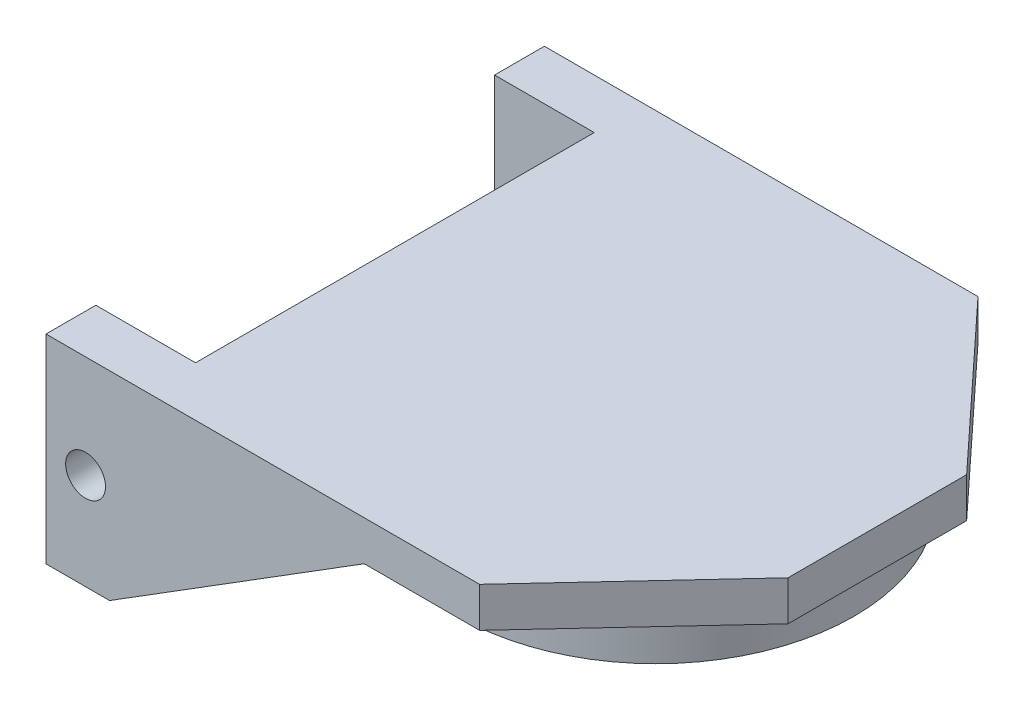
ISO-10303-21;
HEADER;
FILE_DESCRIPTION(('STEP AP214'),'2;1');
FILE_NAME('part.step','',(''),(''),'','','');
FILE_SCHEMA(('AUTOMOTIVE_DESIGN { 1 0 10303 214 1 1 1 1 }'));
ENDSEC;
DATA;
#1=APPLICATION_CONTEXT('core data for automotive mechanical design processes');
#2=APPLICATION_PROTOCOL_DEFINITION('international standard','automotive_design',2000,#1);
#3=PRODUCT_CONTEXT('',#1,'mechanical');
#4=PRODUCT('Part','Part','',(#3));
#5=PRODUCT_RELATED_PRODUCT_CATEGORY('part','',(#4));
#6=PRODUCT_DEFINITION_FORMATION('','',#4);
#7=PRODUCT_DEFINITION_CONTEXT('part definition',#1,'design');
#8=PRODUCT_DEFINITION('design','',#6,#7);
#9=PRODUCT_DEFINITION_SHAPE('','',#8);
#10=(LENGTH_UNIT() NAMED_UNIT(*) SI_UNIT(.MILLI.,.METRE.));
#11=(NAMED_UNIT(*) PLANE_ANGLE_UNIT() SI_UNIT($,.RADIAN.));
#12=(NAMED_UNIT(*) SI_UNIT($,.STERADIAN.) SOLID_ANGLE_UNIT());
#13=UNCERTAINTY_MEASURE_WITH_UNIT(LENGTH_MEASURE(1.E-05),#10,'distance_accuracy_value','');
#14=(GEOMETRIC_REPRESENTATION_CONTEXT(3) GLOBAL_UNCERTAINTY_ASSIGNED_CONTEXT((#13)) GLOBAL_UNIT_ASSIGNED_CONTEXT((#10,
#11,#12)) REPRESENTATION_CONTEXT('',''));
#15=CARTESIAN_POINT('',(0.,0.,0.));
#16=DIRECTION('',(0.,0.,1.));
#17=DIRECTION('',(1.,0.,0.));
#18=AXIS2_PLACEMENT_3D('',#15,#16,#17);
#19=CARTESIAN_POINT('',(0.,0.,0.));
#20=DIRECTION('',(0.,1.,0.));
#21=DIRECTION('',(0.,0.,1.));
#22=AXIS2_PLACEMENT_3D('',#19,#20,#21);
#23=PLANE('',#22);
#24=CARTESIAN_POINT('',(18.0898457890056,0.,-12.5));
#25=DIRECTION('',(0.,1.,0.));
#26=DIRECTION('',(0.,0.,1.));
#27=AXIS2_PLACEMENT_3D('',#24,#25,#26);
#28=CIRCLE('',#27,9.9415763307506);
#29=CARTESIAN_POINT('',(18.0898457890056,0.,-2.55842366924939));
#30=VERTEX_POINT('',#29);
#31=EDGE_CURVE('E11',#30,#30,#28,.F.);
#32=ORIENTED_EDGE('',*,*,#31,.F.);
#33=EDGE_LOOP('',(#32));
#34=FACE_BOUND('',#33,.T.);
#35=DIRECTION('',(0.,0.,1.));
#36=VECTOR('',#35,1.);
#37=CARTESIAN_POINT('',(29.1989422190613,0.,0.));
#38=LINE('',#37,#36);
#39=CARTESIAN_POINT('',(29.1989422190613,0.,-16.9802673249968));
#40=VERTEX_POINT('',#39);
#41=CARTESIAN_POINT('',(29.1989422190613,0.,-8.01973267500323));
#42=VERTEX_POINT('',#41);
#43=EDGE_CURVE('E149',#40,#42,#38,.T.);
#44=ORIENTED_EDGE('',*,*,#43,.T.);
#45=DIRECTION('',(-0.68060560831104,0.,0.73264998869553));
#46=VECTOR('',#45,1.);
#47=CARTESIAN_POINT('',(11.6742864386424,0.,10.8449941251163));
#48=LINE('',#47,#46);
#49=CARTESIAN_POINT('',(21.748897695781,0.,0.));
#50=VERTEX_POINT('',#49);
#51=EDGE_CURVE('E175',#42,#50,#48,.T.);
#52=ORIENTED_EDGE('',*,*,#51,.T.);
#53=DIRECTION('',(1.,0.,0.));
#54=VECTOR('',#53,1.);
#55=CARTESIAN_POINT('',(0.,0.,0.));
#56=LINE('',#55,#54);
#57=CARTESIAN_POINT('',(15.9629524646424,0.,0.));
#58=VERTEX_POINT('',#57);
#59=EDGE_CURVE('E253',#58,#50,#56,.T.);
#60=ORIENTED_EDGE('',*,*,#59,.F.);
#61=DIRECTION('',(0.,0.,1.));
#62=VECTOR('',#61,1.);
#63=CARTESIAN_POINT('',(15.9629524646424,0.,-2.5));
#64=LINE('',#63,#62);
#65=CARTESIAN_POINT('',(15.9629524646424,0.,-2.5));
#66=VERTEX_POINT('',#65);
#67=EDGE_CURVE('E230',#66,#58,#64,.T.);
#68=ORIENTED_EDGE('',*,*,#67,.F.);
#69=DIRECTION('',(1.,0.,0.));
#70=VECTOR('',#69,1.);
#71=CARTESIAN_POINT('',(0.,0.,-2.5));
#72=LINE('',#71,#70);
#73=CARTESIAN_POINT('',(5.,0.,-2.5));
#74=VERTEX_POINT('',#73);
#75=EDGE_CURVE('E48',#74,#66,#72,.T.);
#76=ORIENTED_EDGE('',*,*,#75,.F.);
#77=DIRECTION('',(0.,0.,1.));
#78=VECTOR('',#77,1.);
#79=CARTESIAN_POINT('',(5.,0.,0.));
#80=LINE('',#79,#78);
#81=CARTESIAN_POINT('',(5.,0.,-22.5));
#82=VERTEX_POINT('',#81);
#83=EDGE_CURVE('E229',#82,#74,#80,.T.);
#84=ORIENTED_EDGE('',*,*,#83,.F.);
#85=DIRECTION('',(1.,0.,0.));
#86=VECTOR('',#85,1.);
#87=CARTESIAN_POINT('',(15.9629524646424,0.,-22.5));
#88=LINE('',#87,#86);
#89=CARTESIAN_POINT('',(15.9629524646424,0.,-22.5));
#90=VERTEX_POINT('',#89);
#91=EDGE_CURVE('E63',#82,#90,#88,.T.);
#92=ORIENTED_EDGE('',*,*,#91,.T.);
#93=DIRECTION('',(0.,0.,-1.));
#94=VECTOR('',#93,1.);
#95=CARTESIAN_POINT('',(15.9629524646424,0.,-22.5));
#96=LINE('',#95,#94);
#97=CARTESIAN_POINT('',(15.9629524646424,0.,-25.));
#98=VERTEX_POINT('',#97);
#99=EDGE_CURVE('E193',#90,#98,#96,.T.);
#100=ORIENTED_EDGE('',*,*,#99,.T.);
#101=DIRECTION('',(1.,0.,0.));
#102=VECTOR('',#101,1.);
#103=CARTESIAN_POINT('',(0.,0.,-25.));
#104=LINE('',#103,#102);
#105=CARTESIAN_POINT('',(21.748897695781,0.,-25.));
#106=VERTEX_POINT('',#105);
#107=EDGE_CURVE('E238',#98,#106,#104,.T.);
#108=ORIENTED_EDGE('',*,*,#107,.T.);
#109=DIRECTION('',(0.680605608311039,0.,0.73264998869553));
#110=VECTOR('',#109,1.);
#111=CARTESIAN_POINT('',(24.1404287195224,0.,-22.4255939767273));
#112=LINE('',#111,#110);
#113=EDGE_CURVE('E170',#106,#40,#112,.T.);
#114=ORIENTED_EDGE('',*,*,#113,.T.);
#115=EDGE_LOOP('',(#44,#52,#60,#68,#76,#84,#92,#100,#108,#114));
#116=FACE_BOUND('',#115,.T.);
#117=ADVANCED_FACE('F40',(#34,#116),#23,.F.);
#118=CARTESIAN_POINT('',(0.,2.,-22.5));
#119=DIRECTION('',(0.,0.,-1.));
#120=DIRECTION('',(-1.,0.,0.));
#121=AXIS2_PLACEMENT_3D('',#118,#119,#120);
#122=PLANE('',#121);
#123=DIRECTION('',(0.,-1.,0.));
#124=VECTOR('',#123,1.);
#125=CARTESIAN_POINT('',(0.,2.,-22.5));
#126=LINE('',#125,#124);
#127=CARTESIAN_POINT('',(0.,2.,-22.5));
#128=VERTEX_POINT('',#127);
#129=CARTESIAN_POINT('',(0.,-7.98613617756479,-22.5));
#130=VERTEX_POINT('',#129);
#131=EDGE_CURVE('E258',#128,#130,#126,.T.);
#132=ORIENTED_EDGE('',*,*,#131,.T.);
#133=DIRECTION('',(-1.,0.,0.));
#134=VECTOR('',#133,1.);
#135=CARTESIAN_POINT('',(0.,-7.98613617756479,-22.5));
#136=LINE('',#135,#134);
#137=CARTESIAN_POINT('',(3.18779020650883,-7.98613617756479,-22.5));
#138=VERTEX_POINT('',#137);
#139=EDGE_CURVE('E190',#138,#130,#136,.T.);
#140=ORIENTED_EDGE('',*,*,#139,.F.);
#141=DIRECTION('',(-0.847948787205841,-0.530078158648462,0.));
#142=VECTOR('',#141,1.);
#143=CARTESIAN_POINT('',(3.18779020650883,-7.98613617756479,-22.5));
#144=LINE('',#143,#142);
#145=EDGE_CURVE('E186',#90,#138,#144,.T.);
#146=ORIENTED_EDGE('',*,*,#145,.F.);
#147=ORIENTED_EDGE('',*,*,#91,.F.);
#148=DIRECTION('',(0.,-1.,0.));
#149=VECTOR('',#148,1.);
#150=CARTESIAN_POINT('',(5.,2.,-22.5));
#151=LINE('',#150,#149);
#152=CARTESIAN_POINT('',(5.,2.,-22.5));
#153=VERTEX_POINT('',#152);
#154=EDGE_CURVE('E221',#153,#82,#151,.T.);
#155=ORIENTED_EDGE('',*,*,#154,.F.);
#156=DIRECTION('',(1.,0.,0.));
#157=VECTOR('',#156,1.);
#158=CARTESIAN_POINT('',(0.,2.,-22.5));
#159=LINE('',#158,#157);
#160=EDGE_CURVE('E234',#128,#153,#159,.T.);
#161=ORIENTED_EDGE('',*,*,#160,.F.);
#162=EDGE_LOOP('',(#132,#140,#146,#147,#155,#161));
#163=FACE_BOUND('',#162,.T.);
#164=CARTESIAN_POINT('',(1.98451841065257,-3.14667725421077,-22.5));
#165=DIRECTION('',(0.,0.,-1.));
#166=DIRECTION('',(-1.,0.,0.));
#167=AXIS2_PLACEMENT_3D('',#164,#165,#166);
#168=CIRCLE('',#167,1.);
#169=CARTESIAN_POINT('',(0.984518410652568,-3.14667725421077,-22.5));
#170=VERTEX_POINT('',#169);
#171=EDGE_CURVE('E179',#170,#170,#168,.T.);
#172=ORIENTED_EDGE('',*,*,#171,.T.);
#173=EDGE_LOOP('',(#172));
#174=FACE_BOUND('',#173,.T.);
#175=ADVANCED_FACE('F42',(#163,#174),#122,.F.);
#176=CARTESIAN_POINT('',(5.,2.,0.));
#177=DIRECTION('',(1.,0.,0.));
#178=DIRECTION('',(0.,0.,-1.));
#179=AXIS2_PLACEMENT_3D('',#176,#177,#178);
#180=PLANE('',#179);
#181=ORIENTED_EDGE('',*,*,#83,.T.);
#182=DIRECTION('',(0.,-1.,0.));
#183=VECTOR('',#182,1.);
#184=CARTESIAN_POINT('',(5.,2.,-2.5));
#185=LINE('',#184,#183);
#186=CARTESIAN_POINT('',(5.,2.,-2.5));
#187=VERTEX_POINT('',#186);
#188=EDGE_CURVE('E266',#187,#74,#185,.T.);
#189=ORIENTED_EDGE('',*,*,#188,.F.);
#190=DIRECTION('',(0.,0.,1.));
#191=VECTOR('',#190,1.);
#192=CARTESIAN_POINT('',(5.,2.,0.));
#193=LINE('',#192,#191);
#194=EDGE_CURVE('E237',#153,#187,#193,.T.);
#195=ORIENTED_EDGE('',*,*,#194,.F.);
#196=ORIENTED_EDGE('',*,*,#154,.T.);
#197=EDGE_LOOP('',(#181,#189,#195,#196));
#198=FACE_BOUND('',#197,.T.);
#199=ADVANCED_FACE('F271',(#198),#180,.F.);
#200=CARTESIAN_POINT('',(0.,2.,-2.5));
#201=DIRECTION('',(0.,0.,-1.));
#202=DIRECTION('',(-1.,0.,0.));
#203=AXIS2_PLACEMENT_3D('',#200,#201,#202);
#204=PLANE('',#203);
#205=CARTESIAN_POINT('',(1.98451841065257,-3.14667725421077,-2.5));
#206=DIRECTION('',(0.,0.,1.));
#207=DIRECTION('',(1.,0.,0.));
#208=AXIS2_PLACEMENT_3D('',#205,#206,#207);
#209=CIRCLE('',#208,1.);
#210=CARTESIAN_POINT('',(2.98451841065257,-3.14667725421077,-2.5));
#211=VERTEX_POINT('',#210);
#212=EDGE_CURVE('E205',#211,#211,#209,.T.);
#213=ORIENTED_EDGE('',*,*,#212,.T.);
#214=EDGE_LOOP('',(#213));
#215=FACE_BOUND('',#214,.T.);
#216=ORIENTED_EDGE('',*,*,#188,.T.);
#217=ORIENTED_EDGE('',*,*,#75,.T.);
#218=DIRECTION('',(0.847948787205841,0.530078158648462,0.));
#219=VECTOR('',#218,1.);
#220=CARTESIAN_POINT('',(4.48531594618962,-7.17501401397826,-2.5));
#221=LINE('',#220,#219);
#222=CARTESIAN_POINT('',(3.18779020650883,-7.98613617756479,-2.5));
#223=VERTEX_POINT('',#222);
#224=EDGE_CURVE('E214',#223,#66,#221,.T.);
#225=ORIENTED_EDGE('',*,*,#224,.F.);
#226=DIRECTION('',(1.,0.,0.));
#227=VECTOR('',#226,1.);
#228=CARTESIAN_POINT('',(0.,-7.98613617756479,-2.5));
#229=LINE('',#228,#227);
#230=CARTESIAN_POINT('',(0.,-7.98613617756479,-2.5));
#231=VERTEX_POINT('',#230);
#232=EDGE_CURVE('E211',#231,#223,#229,.T.);
#233=ORIENTED_EDGE('',*,*,#232,.F.);
#234=DIRECTION('',(0.,-1.,0.));
#235=VECTOR('',#234,1.);
#236=CARTESIAN_POINT('',(0.,2.,-2.5));
#237=LINE('',#236,#235);
#238=CARTESIAN_POINT('',(0.,2.,-2.5));
#239=VERTEX_POINT('',#238);
#240=EDGE_CURVE('E264',#239,#231,#237,.T.);
#241=ORIENTED_EDGE('',*,*,#240,.F.);
#242=DIRECTION('',(1.,0.,0.));
#243=VECTOR('',#242,1.);
#244=CARTESIAN_POINT('',(0.,2.,-2.5));
#245=LINE('',#244,#243);
#246=EDGE_CURVE('E240',#239,#187,#245,.T.);
#247=ORIENTED_EDGE('',*,*,#246,.T.);
#248=EDGE_LOOP('',(#216,#217,#225,#233,#241,#247));
#249=FACE_BOUND('',#248,.T.);
#250=ADVANCED_FACE('F294',(#215,#249),#204,.T.);
#251=CARTESIAN_POINT('',(0.,2.,0.));
#252=DIRECTION('',(-1.,0.,0.));
#253=DIRECTION('',(0.,0.,1.));
#254=AXIS2_PLACEMENT_3D('',#251,#252,#253);
#255=PLANE('',#254);
#256=ORIENTED_EDGE('',*,*,#240,.T.);
#257=DIRECTION('',(0.,0.,1.));
#258=VECTOR('',#257,1.);
#259=CARTESIAN_POINT('',(0.,-7.98613617756479,-2.5));
#260=LINE('',#259,#258);
#261=CARTESIAN_POINT('',(0.,-7.98613617756479,0.));
#262=VERTEX_POINT('',#261);
#263=EDGE_CURVE('E226',#231,#262,#260,.T.);
#264=ORIENTED_EDGE('',*,*,#263,.T.);
#265=DIRECTION('',(0.,-1.,0.));
#266=VECTOR('',#265,1.);
#267=CARTESIAN_POINT('',(0.,2.,0.));
#268=LINE('',#267,#266);
#269=CARTESIAN_POINT('',(0.,2.,0.));
#270=VERTEX_POINT('',#269);
#271=EDGE_CURVE('E262',#270,#262,#268,.T.);
#272=ORIENTED_EDGE('',*,*,#271,.F.);
#273=DIRECTION('',(0.,0.,-1.));
#274=VECTOR('',#273,1.);
#275=CARTESIAN_POINT('',(0.,2.,0.));
#276=LINE('',#275,#274);
#277=EDGE_CURVE('E243',#270,#239,#276,.T.);
#278=ORIENTED_EDGE('',*,*,#277,.T.);
#279=EDGE_LOOP('',(#256,#264,#272,#278));
#280=FACE_BOUND('',#279,.T.);
#281=ADVANCED_FACE('F299',(#280),#255,.T.);
#282=CARTESIAN_POINT('',(0.,2.,0.));
#283=DIRECTION('',(0.,0.,-1.));
#284=DIRECTION('',(-1.,0.,0.));
#285=AXIS2_PLACEMENT_3D('',#282,#283,#284);
#286=PLANE('',#285);
#287=CARTESIAN_POINT('',(1.98451841065257,-3.14667725421077,0.));
#288=DIRECTION('',(0.,0.,1.));
#289=DIRECTION('',(1.,0.,0.));
#290=AXIS2_PLACEMENT_3D('',#287,#288,#289);
#291=CIRCLE('',#290,1.);
#292=CARTESIAN_POINT('',(2.98451841065257,-3.14667725421077,0.));
#293=VERTEX_POINT('',#292);
#294=EDGE_CURVE('E201',#293,#293,#291,.T.);
#295=ORIENTED_EDGE('',*,*,#294,.F.);
#296=EDGE_LOOP('',(#295));
#297=FACE_BOUND('',#296,.T.);
#298=ORIENTED_EDGE('',*,*,#59,.T.);
#299=DIRECTION('',(0.,1.,0.));
#300=VECTOR('',#299,1.);
#301=CARTESIAN_POINT('',(21.748897695781,-0.5,0.));
#302=LINE('',#301,#300);
#303=CARTESIAN_POINT('',(21.748897695781,2.,0.));
#304=VERTEX_POINT('',#303);
#305=EDGE_CURVE('E167',#50,#304,#302,.T.);
#306=ORIENTED_EDGE('',*,*,#305,.T.);
#307=DIRECTION('',(1.,0.,0.));
#308=VECTOR('',#307,1.);
#309=CARTESIAN_POINT('',(0.,2.,0.));
#310=LINE('',#309,#308);
#311=EDGE_CURVE('E246',#270,#304,#310,.T.);
#312=ORIENTED_EDGE('',*,*,#311,.F.);
#313=ORIENTED_EDGE('',*,*,#271,.T.);
#314=DIRECTION('',(1.,0.,0.));
#315=VECTOR('',#314,1.);
#316=CARTESIAN_POINT('',(0.,-7.98613617756479,0.));
#317=LINE('',#316,#315);
#318=CARTESIAN_POINT('',(3.18779020650883,-7.98613617756479,0.));
#319=VERTEX_POINT('',#318);
#320=EDGE_CURVE('E208',#262,#319,#317,.T.);
#321=ORIENTED_EDGE('',*,*,#320,.T.);
#322=DIRECTION('',(0.847948787205841,0.530078158648462,0.));
#323=VECTOR('',#322,1.);
#324=CARTESIAN_POINT('',(4.48531594618962,-7.17501401397826,0.));
#325=LINE('',#324,#323);
#326=EDGE_CURVE('E215',#319,#58,#325,.T.);
#327=ORIENTED_EDGE('',*,*,#326,.T.);
#328=EDGE_LOOP('',(#298,#306,#312,#313,#321,#327));
#329=FACE_BOUND('',#328,.T.);
#330=ADVANCED_FACE('F305',(#297,#329),#286,.F.);
#331=CARTESIAN_POINT('',(0.,2.,-25.));
#332=DIRECTION('',(0.,0.,-1.));
#333=DIRECTION('',(-1.,0.,0.));
#334=AXIS2_PLACEMENT_3D('',#331,#332,#333);
#335=PLANE('',#334);
#336=DIRECTION('',(0.,1.,0.));
#337=VECTOR('',#336,1.);
#338=CARTESIAN_POINT('',(21.748897695781,-0.5,-25.));
#339=LINE('',#338,#337);
#340=CARTESIAN_POINT('',(21.748897695781,2.,-25.));
#341=VERTEX_POINT('',#340);
#342=EDGE_CURVE('E55',#106,#341,#339,.T.);
#343=ORIENTED_EDGE('',*,*,#342,.F.);
#344=ORIENTED_EDGE('',*,*,#107,.F.);
#345=DIRECTION('',(-0.847948787205841,-0.530078158648462,0.));
#346=VECTOR('',#345,1.);
#347=CARTESIAN_POINT('',(3.18779020650883,-7.98613617756479,-25.));
#348=LINE('',#347,#346);
#349=CARTESIAN_POINT('',(3.18779020650883,-7.98613617756479,-25.));
#350=VERTEX_POINT('',#349);
#351=EDGE_CURVE('E182',#98,#350,#348,.T.);
#352=ORIENTED_EDGE('',*,*,#351,.T.);
#353=DIRECTION('',(-1.,0.,0.));
#354=VECTOR('',#353,1.);
#355=CARTESIAN_POINT('',(0.,-7.98613617756479,-25.));
#356=LINE('',#355,#354);
#357=CARTESIAN_POINT('',(0.,-7.98613617756479,-25.));
#358=VERTEX_POINT('',#357);
#359=EDGE_CURVE('E187',#350,#358,#356,.T.);
#360=ORIENTED_EDGE('',*,*,#359,.T.);
#361=DIRECTION('',(0.,-1.,0.));
#362=VECTOR('',#361,1.);
#363=CARTESIAN_POINT('',(0.,2.,-25.));
#364=LINE('',#363,#362);
#365=CARTESIAN_POINT('',(0.,2.,-25.));
#366=VERTEX_POINT('',#365);
#367=EDGE_CURVE('E260',#366,#358,#364,.T.);
#368=ORIENTED_EDGE('',*,*,#367,.F.);
#369=DIRECTION('',(1.,0.,0.));
#370=VECTOR('',#369,1.);
#371=CARTESIAN_POINT('',(0.,2.,-25.));
#372=LINE('',#371,#370);
#373=EDGE_CURVE('E249',#366,#341,#372,.T.);
#374=ORIENTED_EDGE('',*,*,#373,.T.);
#375=EDGE_LOOP('',(#343,#344,#352,#360,#368,#374));
#376=FACE_BOUND('',#375,.T.);
#377=CARTESIAN_POINT('',(1.98451841065257,-3.14667725421077,-25.));
#378=DIRECTION('',(0.,0.,-1.));
#379=DIRECTION('',(-1.,0.,0.));
#380=AXIS2_PLACEMENT_3D('',#377,#378,#379);
#381=CIRCLE('',#380,1.);
#382=CARTESIAN_POINT('',(0.984518410652568,-3.14667725421077,-25.));
#383=VERTEX_POINT('',#382);
#384=EDGE_CURVE('E178',#383,#383,#381,.T.);
#385=ORIENTED_EDGE('',*,*,#384,.F.);
#386=EDGE_LOOP('',(#385));
#387=FACE_BOUND('',#386,.T.);
#388=ADVANCED_FACE('F284',(#376,#387),#335,.T.);
#389=ORIENTED_EDGE('',*,*,#367,.T.);
#390=DIRECTION('',(0.,0.,-1.));
#391=VECTOR('',#390,1.);
#392=CARTESIAN_POINT('',(0.,-7.98613617756479,-22.5));
#393=LINE('',#392,#391);
#394=EDGE_CURVE('E198',#130,#358,#393,.T.);
#395=ORIENTED_EDGE('',*,*,#394,.F.);
#396=ORIENTED_EDGE('',*,*,#131,.F.);
#397=EDGE_CURVE('E247',#128,#366,#276,.T.);
#398=ORIENTED_EDGE('',*,*,#397,.T.);
#399=EDGE_LOOP('',(#389,#395,#396,#398));
#400=FACE_BOUND('',#399,.T.);
#401=ADVANCED_FACE('F289',(#400),#255,.T.);
#402=CARTESIAN_POINT('',(0.,2.,0.));
#403=DIRECTION('',(0.,1.,0.));
#404=DIRECTION('',(0.,0.,1.));
#405=AXIS2_PLACEMENT_3D('',#402,#403,#404);
#406=PLANE('',#405);
#407=DIRECTION('',(-0.68060560831104,0.,0.73264998869553));
#408=VECTOR('',#407,1.);
#409=CARTESIAN_POINT('',(29.1989422190613,2.,-8.01973267500323));
#410=LINE('',#409,#408);
#411=CARTESIAN_POINT('',(29.1989422190613,2.,-8.01973267500323));
#412=VERTEX_POINT('',#411);
#413=EDGE_CURVE('E162',#412,#304,#410,.T.);
#414=ORIENTED_EDGE('',*,*,#413,.F.);
#415=DIRECTION('',(0.,0.,1.));
#416=VECTOR('',#415,1.);
#417=CARTESIAN_POINT('',(29.1989422190613,2.,-16.9802673249968));
#418=LINE('',#417,#416);
#419=CARTESIAN_POINT('',(29.1989422190613,2.,-16.9802673249968));
#420=VERTEX_POINT('',#419);
#421=EDGE_CURVE('E146',#420,#412,#418,.T.);
#422=ORIENTED_EDGE('',*,*,#421,.F.);
#423=DIRECTION('',(0.680605608311039,0.,0.73264998869553));
#424=VECTOR('',#423,1.);
#425=CARTESIAN_POINT('',(21.748897695781,2.,-25.));
#426=LINE('',#425,#424);
#427=EDGE_CURVE('E153',#341,#420,#426,.T.);
#428=ORIENTED_EDGE('',*,*,#427,.F.);
#429=ORIENTED_EDGE('',*,*,#373,.F.);
#430=ORIENTED_EDGE('',*,*,#397,.F.);
#431=ORIENTED_EDGE('',*,*,#160,.T.);
#432=ORIENTED_EDGE('',*,*,#194,.T.);
#433=ORIENTED_EDGE('',*,*,#246,.F.);
#434=ORIENTED_EDGE('',*,*,#277,.F.);
#435=ORIENTED_EDGE('',*,*,#311,.T.);
#436=EDGE_LOOP('',(#414,#422,#428,#429,#430,#431,#432,#433,#434,#435));
#437=FACE_BOUND('',#436,.T.);
#438=ADVANCED_FACE('F160',(#437),#406,.T.);
#439=CARTESIAN_POINT('',(0.,-7.98613617756479,-2.5));
#440=DIRECTION('',(0.,-1.,0.));
#441=DIRECTION('',(0.,0.,-1.));
#442=AXIS2_PLACEMENT_3D('',#439,#440,#441);
#443=PLANE('',#442);
#444=ORIENTED_EDGE('',*,*,#320,.F.);
#445=ORIENTED_EDGE('',*,*,#263,.F.);
#446=ORIENTED_EDGE('',*,*,#232,.T.);
#447=DIRECTION('',(0.,0.,1.));
#448=VECTOR('',#447,1.);
#449=CARTESIAN_POINT('',(3.18779020650883,-7.98613617756479,-2.5));
#450=LINE('',#449,#448);
#451=EDGE_CURVE('E218',#223,#319,#450,.T.);
#452=ORIENTED_EDGE('',*,*,#451,.T.);
#453=EDGE_LOOP('',(#444,#445,#446,#452));
#454=FACE_BOUND('',#453,.T.);
#455=ADVANCED_FACE('F302',(#454),#443,.T.);
#456=CARTESIAN_POINT('',(4.48531594618962,-7.17501401397826,-2.5));
#457=DIRECTION('',(0.530078158648462,-0.847948787205841,0.));
#458=DIRECTION('',(0.847948787205841,0.530078158648462,0.));
#459=AXIS2_PLACEMENT_3D('',#456,#457,#458);
#460=PLANE('',#459);
#461=ORIENTED_EDGE('',*,*,#326,.F.);
#462=ORIENTED_EDGE('',*,*,#451,.F.);
#463=ORIENTED_EDGE('',*,*,#224,.T.);
#464=ORIENTED_EDGE('',*,*,#67,.T.);
#465=EDGE_LOOP('',(#461,#462,#463,#464));
#466=FACE_BOUND('',#465,.T.);
#467=ADVANCED_FACE('F310',(#466),#460,.T.);
#468=CARTESIAN_POINT('',(1.98451841065257,-3.14667725421077,-2.5));
#469=DIRECTION('',(0.,0.,1.));
#470=DIRECTION('',(1.,0.,0.));
#471=AXIS2_PLACEMENT_3D('',#468,#469,#470);
#472=CYLINDRICAL_SURFACE('',#471,1.);
#473=ORIENTED_EDGE('',*,*,#212,.F.);
#474=EDGE_LOOP('',(#473));
#475=FACE_BOUND('',#474,.T.);
#476=ORIENTED_EDGE('',*,*,#294,.T.);
#477=EDGE_LOOP('',(#476));
#478=FACE_BOUND('',#477,.T.);
#479=ADVANCED_FACE('F312',(#475,#478),#472,.F.);
#480=CARTESIAN_POINT('',(0.,-7.98613617756479,-22.5));
#481=DIRECTION('',(0.,-1.,0.));
#482=DIRECTION('',(0.,0.,-1.));
#483=AXIS2_PLACEMENT_3D('',#480,#481,#482);
#484=PLANE('',#483);
#485=ORIENTED_EDGE('',*,*,#359,.F.);
#486=DIRECTION('',(0.,0.,-1.));
#487=VECTOR('',#486,1.);
#488=CARTESIAN_POINT('',(3.18779020650883,-7.98613617756479,-22.5));
#489=LINE('',#488,#487);
#490=EDGE_CURVE('E202',#138,#350,#489,.T.);
#491=ORIENTED_EDGE('',*,*,#490,.F.);
#492=ORIENTED_EDGE('',*,*,#139,.T.);
#493=ORIENTED_EDGE('',*,*,#394,.T.);
#494=EDGE_LOOP('',(#485,#491,#492,#493));
#495=FACE_BOUND('',#494,.T.);
#496=ADVANCED_FACE('F318',(#495),#484,.T.);
#497=CARTESIAN_POINT('',(3.18779020650883,-7.98613617756479,-22.5));
#498=DIRECTION('',(0.530078158648462,-0.847948787205841,0.));
#499=DIRECTION('',(0.847948787205841,0.530078158648462,0.));
#500=AXIS2_PLACEMENT_3D('',#497,#498,#499);
#501=PLANE('',#500);
#502=ORIENTED_EDGE('',*,*,#351,.F.);
#503=ORIENTED_EDGE('',*,*,#99,.F.);
#504=ORIENTED_EDGE('',*,*,#145,.T.);
#505=ORIENTED_EDGE('',*,*,#490,.T.);
#506=EDGE_LOOP('',(#502,#503,#504,#505));
#507=FACE_BOUND('',#506,.T.);
#508=ADVANCED_FACE('F280',(#507),#501,.T.);
#509=CARTESIAN_POINT('',(1.98451841065257,-3.14667725421077,-22.5));
#510=DIRECTION('',(0.,0.,-1.));
#511=DIRECTION('',(-1.,0.,0.));
#512=AXIS2_PLACEMENT_3D('',#509,#510,#511);
#513=CYLINDRICAL_SURFACE('',#512,1.);
#514=ORIENTED_EDGE('',*,*,#171,.F.);
#515=EDGE_LOOP('',(#514));
#516=FACE_BOUND('',#515,.T.);
#517=ORIENTED_EDGE('',*,*,#384,.T.);
#518=EDGE_LOOP('',(#517));
#519=FACE_BOUND('',#518,.T.);
#520=ADVANCED_FACE('F365',(#516,#519),#513,.F.);
#521=CARTESIAN_POINT('',(29.1989422190613,-0.5,-8.01973267500323));
#522=DIRECTION('',(-0.732649988695529,0.,-0.68060560831104));
#523=DIRECTION('',(-0.68060560831104,0.,0.73264998869553));
#524=AXIS2_PLACEMENT_3D('',#521,#522,#523);
#525=PLANE('',#524);
#526=DIRECTION('',(0.,1.,0.));
#527=VECTOR('',#526,1.);
#528=CARTESIAN_POINT('',(29.1989422190613,-0.5,-8.01973267500323));
#529=LINE('',#528,#527);
#530=EDGE_CURVE('E151',#42,#412,#529,.T.);
#531=ORIENTED_EDGE('',*,*,#530,.T.);
#532=ORIENTED_EDGE('',*,*,#413,.T.);
#533=ORIENTED_EDGE('',*,*,#305,.F.);
#534=ORIENTED_EDGE('',*,*,#51,.F.);
#535=EDGE_LOOP('',(#531,#532,#533,#534));
#536=FACE_BOUND('',#535,.T.);
#537=ADVANCED_FACE('F308',(#536),#525,.F.);
#538=CARTESIAN_POINT('',(29.1989422190613,-0.5,-16.9802673249968));
#539=DIRECTION('',(-1.,0.,0.));
#540=DIRECTION('',(0.,0.,1.));
#541=AXIS2_PLACEMENT_3D('',#538,#539,#540);
#542=PLANE('',#541);
#543=DIRECTION('',(0.,1.,0.));
#544=VECTOR('',#543,1.);
#545=CARTESIAN_POINT('',(29.1989422190613,-0.5,-16.9802673249968));
#546=LINE('',#545,#544);
#547=EDGE_CURVE('E142',#40,#420,#546,.T.);
#548=ORIENTED_EDGE('',*,*,#547,.T.);
#549=ORIENTED_EDGE('',*,*,#421,.T.);
#550=ORIENTED_EDGE('',*,*,#530,.F.);
#551=ORIENTED_EDGE('',*,*,#43,.F.);
#552=EDGE_LOOP('',(#548,#549,#550,#551));
#553=FACE_BOUND('',#552,.T.);
#554=ADVANCED_FACE('F143',(#553),#542,.F.);
#555=CARTESIAN_POINT('',(21.748897695781,-0.5,-25.));
#556=DIRECTION('',(-0.73264998869553,0.,0.680605608311039));
#557=DIRECTION('',(0.680605608311039,0.,0.73264998869553));
#558=AXIS2_PLACEMENT_3D('',#555,#556,#557);
#559=PLANE('',#558);
#560=ORIENTED_EDGE('',*,*,#342,.T.);
#561=ORIENTED_EDGE('',*,*,#427,.T.);
#562=ORIENTED_EDGE('',*,*,#547,.F.);
#563=ORIENTED_EDGE('',*,*,#113,.F.);
#564=EDGE_LOOP('',(#560,#561,#562,#563));
#565=FACE_BOUND('',#564,.T.);
#566=ADVANCED_FACE('F154',(#565),#559,.F.);
#567=CARTESIAN_POINT('',(18.0898457890056,-2.5,-12.5));
#568=DIRECTION('',(0.,-1.,0.));
#569=DIRECTION('',(0.,0.,-1.));
#570=AXIS2_PLACEMENT_3D('',#567,#568,#569);
#571=PLANE('',#570);
#572=CARTESIAN_POINT('',(18.0898457890056,-2.5,-12.5));
#573=DIRECTION('',(0.,-1.,0.));
#574=DIRECTION('',(0.,0.,-1.));
#575=AXIS2_PLACEMENT_3D('',#572,#573,#574);
#576=CIRCLE('',#575,9.9415763307506);
#577=CARTESIAN_POINT('',(18.0898457890056,-2.5,-22.4415763307506));
#578=VERTEX_POINT('',#577);
#579=EDGE_CURVE('E158',#578,#578,#576,.T.);
#580=ORIENTED_EDGE('',*,*,#579,.T.);
#581=EDGE_LOOP('',(#580));
#582=FACE_BOUND('',#581,.T.);
#583=CARTESIAN_POINT('',(18.0898457890056,-2.5,-12.5));
#584=DIRECTION('',(0.,-1.,0.));
#585=DIRECTION('',(0.,0.,-1.));
#586=AXIS2_PLACEMENT_3D('',#583,#584,#585);
#587=CIRCLE('',#586,9.5);
#588=CARTESIAN_POINT('',(18.0898457890056,-2.5,-22.));
#589=VERTEX_POINT('',#588);
#590=EDGE_CURVE('E345',#589,#589,#587,.T.);
#591=ORIENTED_EDGE('',*,*,#590,.F.);
#592=EDGE_LOOP('',(#591));
#593=FACE_BOUND('',#592,.T.);
#594=ADVANCED_FACE('F352',(#582,#593),#571,.T.);
#595=CARTESIAN_POINT('',(18.0898457890056,-2.5,-12.5));
#596=DIRECTION('',(0.,1.,0.));
#597=DIRECTION('',(0.,0.,1.));
#598=AXIS2_PLACEMENT_3D('',#595,#596,#597);
#599=CYLINDRICAL_SURFACE('',#598,9.9415763307506);
#600=ORIENTED_EDGE('',*,*,#579,.F.);
#601=EDGE_LOOP('',(#600));
#602=FACE_BOUND('',#601,.T.);
#603=ORIENTED_EDGE('',*,*,#31,.T.);
#604=EDGE_LOOP('',(#603));
#605=FACE_BOUND('',#604,.T.);
#606=ADVANCED_FACE('F338',(#602,#605),#599,.T.);
#607=CARTESIAN_POINT('',(18.0898457890056,-2.5,-12.5));
#608=DIRECTION('',(0.,1.,0.));
#609=DIRECTION('',(0.,0.,1.));
#610=AXIS2_PLACEMENT_3D('',#607,#608,#609);
#611=CYLINDRICAL_SURFACE('',#610,9.5);
#612=ORIENTED_EDGE('',*,*,#590,.T.);
#613=EDGE_LOOP('',(#612));
#614=FACE_BOUND('',#613,.T.);
#615=CARTESIAN_POINT('',(18.0898457890056,0.,-12.5));
#616=DIRECTION('',(0.,-1.,0.));
#617=DIRECTION('',(0.,0.,-1.));
#618=AXIS2_PLACEMENT_3D('',#615,#616,#617);
#619=CIRCLE('',#618,9.5);
#620=CARTESIAN_POINT('',(18.0898457890056,0.,-22.));
#621=VERTEX_POINT('',#620);
#622=EDGE_CURVE('E343',#621,#621,#619,.T.);
#623=ORIENTED_EDGE('',*,*,#622,.F.);
#624=EDGE_LOOP('',(#623));
#625=FACE_BOUND('',#624,.T.);
#626=ADVANCED_FACE('F333',(#614,#625),#611,.F.);
#627=ORIENTED_EDGE('',*,*,#622,.T.);
#628=EDGE_LOOP('',(#627));
#629=FACE_BOUND('',#628,.T.);
#630=ADVANCED_FACE('F325',(#629),#23,.F.);
#631=CLOSED_SHELL('',(#117,#175,#199,#250,#281,#330,#388,#401,#438,#455,#467,#479,#496,#508,
#520,#537,#554,#566,#594,#606,#626,#630));
#632=MANIFOLD_SOLID_BREP('B2',#631);
#633=ADVANCED_BREP_SHAPE_REPRESENTATION('',(#18,#632),#14);
#634=SHAPE_DEFINITION_REPRESENTATION(#9,#633);
ENDSEC;
END-ISO-10303-21;
